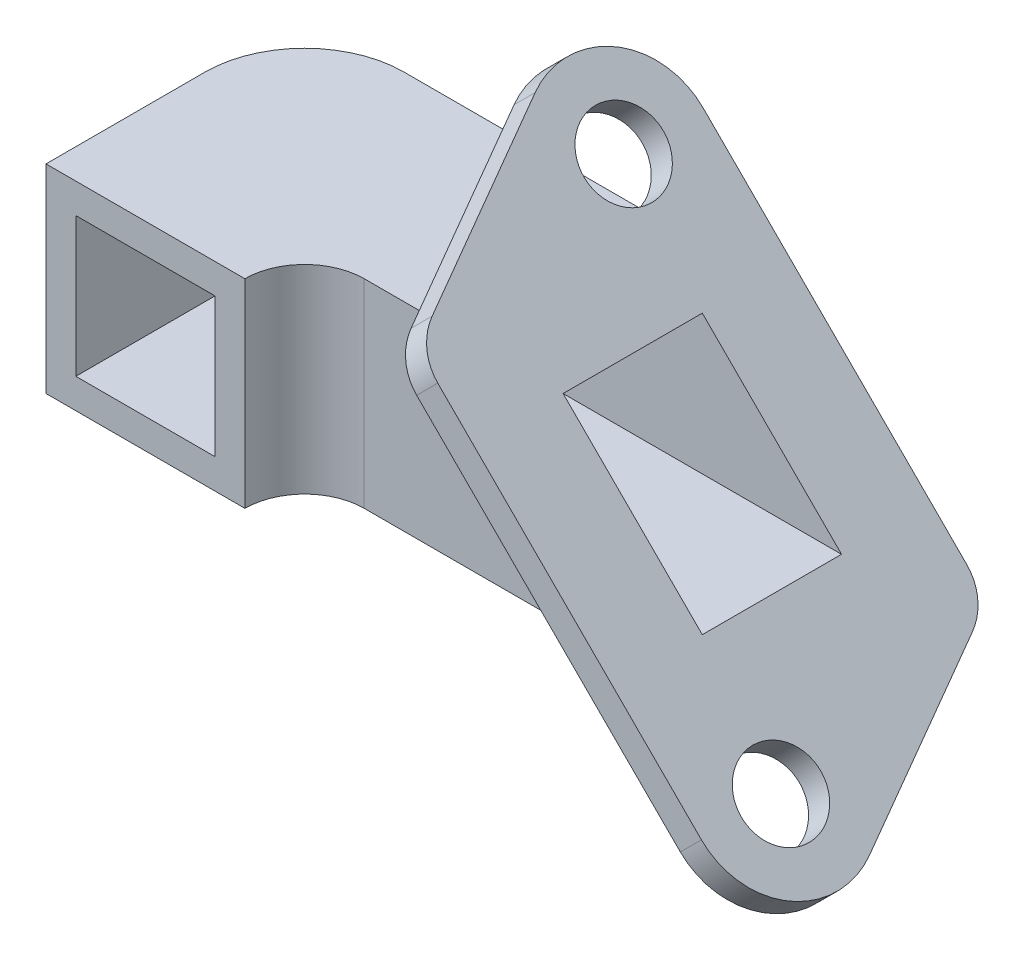
ISO-10303-21;
HEADER;
FILE_DESCRIPTION(('STEP AP214'),'2;1');
FILE_NAME('part.step','',(''),(''),'','','');
FILE_SCHEMA(('AUTOMOTIVE_DESIGN { 1 0 10303 214 1 1 1 1 }'));
ENDSEC;
DATA;
#1=APPLICATION_CONTEXT('core data for automotive mechanical design processes');
#2=APPLICATION_PROTOCOL_DEFINITION('international standard','automotive_design',2000,#1);
#3=PRODUCT_CONTEXT('',#1,'mechanical');
#4=PRODUCT('Part','Part','',(#3));
#5=PRODUCT_RELATED_PRODUCT_CATEGORY('part','',(#4));
#6=PRODUCT_DEFINITION_FORMATION('','',#4);
#7=PRODUCT_DEFINITION_CONTEXT('part definition',#1,'design');
#8=PRODUCT_DEFINITION('design','',#6,#7);
#9=PRODUCT_DEFINITION_SHAPE('','',#8);
#10=(LENGTH_UNIT() NAMED_UNIT(*) SI_UNIT(.MILLI.,.METRE.));
#11=(NAMED_UNIT(*) PLANE_ANGLE_UNIT() SI_UNIT($,.RADIAN.));
#12=(NAMED_UNIT(*) SI_UNIT($,.STERADIAN.) SOLID_ANGLE_UNIT());
#13=UNCERTAINTY_MEASURE_WITH_UNIT(LENGTH_MEASURE(1.E-05),#10,'distance_accuracy_value','');
#14=(GEOMETRIC_REPRESENTATION_CONTEXT(3) GLOBAL_UNCERTAINTY_ASSIGNED_CONTEXT((#13)) GLOBAL_UNIT_ASSIGNED_CONTEXT((#10,
#11,#12)) REPRESENTATION_CONTEXT('',''));
#15=CARTESIAN_POINT('',(0.,0.,0.));
#16=DIRECTION('',(0.,0.,1.));
#17=DIRECTION('',(1.,0.,0.));
#18=AXIS2_PLACEMENT_3D('',#15,#16,#17);
#19=CARTESIAN_POINT('',(56.4558356335607,20.,20.));
#20=DIRECTION('',(0.,0.,-1.));
#21=DIRECTION('',(-1.,0.,0.));
#22=AXIS2_PLACEMENT_3D('',#19,#20,#21);
#23=PLANE('',#22);
#24=DIRECTION('',(0.707106781186546,-0.707106781186549,0.));
#25=VECTOR('',#24,1.);
#26=CARTESIAN_POINT('',(13.985277129661,-22.4705585038996,20.));
#27=LINE('',#26,#25);
#28=CARTESIAN_POINT('',(-28.4852813742385,20.,20.));
#29=VERTEX_POINT('',#28);
#30=CARTESIAN_POINT('',(11.5147186257614,-20.,20.));
#31=VERTEX_POINT('',#30);
#32=EDGE_CURVE('E53',#29,#31,#27,.T.);
#33=ORIENTED_EDGE('',*,*,#32,.F.);
#34=DIRECTION('',(1.,0.,0.));
#35=VECTOR('',#34,1.);
#36=CARTESIAN_POINT('',(56.4558356335607,20.,20.));
#37=LINE('',#36,#35);
#38=CARTESIAN_POINT('',(-48.,20.,20.));
#39=VERTEX_POINT('',#38);
#40=EDGE_CURVE('E322',#39,#29,#37,.T.);
#41=ORIENTED_EDGE('',*,*,#40,.F.);
#42=DIRECTION('',(0.,-1.,0.));
#43=VECTOR('',#42,1.);
#44=CARTESIAN_POINT('',(-48.,20.,20.));
#45=LINE('',#44,#43);
#46=CARTESIAN_POINT('',(-48.,-20.,20.));
#47=VERTEX_POINT('',#46);
#48=EDGE_CURVE('E38',#39,#47,#45,.T.);
#49=ORIENTED_EDGE('',*,*,#48,.T.);
#50=DIRECTION('',(1.,0.,0.));
#51=VECTOR('',#50,1.);
#52=CARTESIAN_POINT('',(56.4558356335607,-20.,20.));
#53=LINE('',#52,#51);
#54=EDGE_CURVE('E336',#47,#31,#53,.T.);
#55=ORIENTED_EDGE('',*,*,#54,.T.);
#56=EDGE_LOOP('',(#33,#41,#49,#55));
#57=FACE_BOUND('',#56,.T.);
#58=ADVANCED_FACE('F30',(#57),#23,.F.);
#59=CARTESIAN_POINT('',(-80.,20.,-20.));
#60=DIRECTION('',(0.,0.,1.));
#61=DIRECTION('',(1.,0.,0.));
#62=AXIS2_PLACEMENT_3D('',#59,#60,#61);
#63=PLANE('',#62);
#64=DIRECTION('',(-0.707106781186546,0.707106781186549,0.));
#65=VECTOR('',#64,1.);
#66=CARTESIAN_POINT('',(-54.2426406871191,45.7573593128808,-20.));
#67=LINE('',#66,#65);
#68=CARTESIAN_POINT('',(11.5147186257614,-20.,-20.));
#69=VERTEX_POINT('',#68);
#70=CARTESIAN_POINT('',(-28.4852813742385,20.,-20.));
#71=VERTEX_POINT('',#70);
#72=EDGE_CURVE('E262',#69,#71,#67,.T.);
#73=ORIENTED_EDGE('',*,*,#72,.F.);
#74=DIRECTION('',(-1.,0.,0.));
#75=VECTOR('',#74,1.);
#76=CARTESIAN_POINT('',(-80.,-20.,-20.));
#77=LINE('',#76,#75);
#78=CARTESIAN_POINT('',(-80.,-20.,-20.));
#79=VERTEX_POINT('',#78);
#80=EDGE_CURVE('E338',#69,#79,#77,.T.);
#81=ORIENTED_EDGE('',*,*,#80,.T.);
#82=DIRECTION('',(0.,-1.,0.));
#83=VECTOR('',#82,1.);
#84=CARTESIAN_POINT('',(-80.,20.,-20.));
#85=LINE('',#84,#83);
#86=CARTESIAN_POINT('',(-80.,20.,-20.));
#87=VERTEX_POINT('',#86);
#88=EDGE_CURVE('E353',#87,#79,#85,.T.);
#89=ORIENTED_EDGE('',*,*,#88,.F.);
#90=DIRECTION('',(-1.,0.,0.));
#91=VECTOR('',#90,1.);
#92=CARTESIAN_POINT('',(-80.,20.,-20.));
#93=LINE('',#92,#91);
#94=EDGE_CURVE('E325',#71,#87,#93,.T.);
#95=ORIENTED_EDGE('',*,*,#94,.F.);
#96=EDGE_LOOP('',(#73,#81,#89,#95));
#97=FACE_BOUND('',#96,.T.);
#98=ADVANCED_FACE('F370',(#97),#63,.F.);
#99=CARTESIAN_POINT('',(-48.,20.,32.));
#100=DIRECTION('',(0.,1.,0.));
#101=DIRECTION('',(0.,0.,1.));
#102=AXIS2_PLACEMENT_3D('',#99,#100,#101);
#103=PLANE('',#102);
#104=ORIENTED_EDGE('',*,*,#40,.T.);
#105=DIRECTION('',(0.,0.,-1.));
#106=VECTOR('',#105,1.);
#107=CARTESIAN_POINT('',(-28.4852813742385,20.,32.));
#108=LINE('',#107,#106);
#109=EDGE_CURVE('E45',#29,#71,#108,.T.);
#110=ORIENTED_EDGE('',*,*,#109,.T.);
#111=ORIENTED_EDGE('',*,*,#94,.T.);
#112=CARTESIAN_POINT('',(-80.,20.,0.));
#113=DIRECTION('',(0.,1.,0.));
#114=DIRECTION('',(0.,0.,-1.));
#115=AXIS2_PLACEMENT_3D('',#112,#113,#114);
#116=CIRCLE('',#115,20.);
#117=CARTESIAN_POINT('',(-100.,20.,0.));
#118=VERTEX_POINT('',#117);
#119=EDGE_CURVE('E327',#87,#118,#116,.T.);
#120=ORIENTED_EDGE('',*,*,#119,.T.);
#121=DIRECTION('',(0.,0.,1.));
#122=VECTOR('',#121,1.);
#123=CARTESIAN_POINT('',(-100.,20.,32.));
#124=LINE('',#123,#122);
#125=CARTESIAN_POINT('',(-100.,20.,32.));
#126=VERTEX_POINT('',#125);
#127=EDGE_CURVE('E329',#118,#126,#124,.T.);
#128=ORIENTED_EDGE('',*,*,#127,.T.);
#129=DIRECTION('',(1.,0.,0.));
#130=VECTOR('',#129,1.);
#131=CARTESIAN_POINT('',(-60.,20.,32.));
#132=LINE('',#131,#130);
#133=CARTESIAN_POINT('',(-60.,20.,32.));
#134=VERTEX_POINT('',#133);
#135=EDGE_CURVE('E331',#126,#134,#132,.T.);
#136=ORIENTED_EDGE('',*,*,#135,.T.);
#137=CARTESIAN_POINT('',(-48.,20.,32.));
#138=DIRECTION('',(0.,-1.,0.));
#139=DIRECTION('',(0.,0.,1.));
#140=AXIS2_PLACEMENT_3D('',#137,#138,#139);
#141=CIRCLE('',#140,12.);
#142=EDGE_CURVE('E319',#134,#39,#141,.T.);
#143=ORIENTED_EDGE('',*,*,#142,.T.);
#144=EDGE_LOOP('',(#104,#110,#111,#120,#128,#136,#143));
#145=FACE_BOUND('',#144,.T.);
#146=ADVANCED_FACE('F373',(#145),#103,.T.);
#147=CARTESIAN_POINT('',(-48.,-20.,32.));
#148=DIRECTION('',(0.,1.,0.));
#149=DIRECTION('',(0.,0.,1.));
#150=AXIS2_PLACEMENT_3D('',#147,#148,#149);
#151=PLANE('',#150);
#152=DIRECTION('',(0.,0.,-1.));
#153=VECTOR('',#152,1.);
#154=CARTESIAN_POINT('',(11.5147186257614,-20.,32.));
#155=LINE('',#154,#153);
#156=EDGE_CURVE('E248',#31,#69,#155,.T.);
#157=ORIENTED_EDGE('',*,*,#156,.F.);
#158=ORIENTED_EDGE('',*,*,#54,.F.);
#159=CARTESIAN_POINT('',(-48.,-20.,32.));
#160=DIRECTION('',(0.,-1.,0.));
#161=DIRECTION('',(0.,0.,1.));
#162=AXIS2_PLACEMENT_3D('',#159,#160,#161);
#163=CIRCLE('',#162,12.);
#164=CARTESIAN_POINT('',(-60.,-20.,32.));
#165=VERTEX_POINT('',#164);
#166=EDGE_CURVE('E282',#165,#47,#163,.T.);
#167=ORIENTED_EDGE('',*,*,#166,.F.);
#168=DIRECTION('',(1.,0.,0.));
#169=VECTOR('',#168,1.);
#170=CARTESIAN_POINT('',(-60.,-20.,32.));
#171=LINE('',#170,#169);
#172=CARTESIAN_POINT('',(-100.,-20.,32.));
#173=VERTEX_POINT('',#172);
#174=EDGE_CURVE('E323',#173,#165,#171,.T.);
#175=ORIENTED_EDGE('',*,*,#174,.F.);
#176=DIRECTION('',(0.,0.,1.));
#177=VECTOR('',#176,1.);
#178=CARTESIAN_POINT('',(-100.,-20.,32.));
#179=LINE('',#178,#177);
#180=CARTESIAN_POINT('',(-100.,-20.,0.));
#181=VERTEX_POINT('',#180);
#182=EDGE_CURVE('E342',#181,#173,#179,.T.);
#183=ORIENTED_EDGE('',*,*,#182,.F.);
#184=CARTESIAN_POINT('',(-80.,-20.,0.));
#185=DIRECTION('',(0.,1.,0.));
#186=DIRECTION('',(0.,0.,-1.));
#187=AXIS2_PLACEMENT_3D('',#184,#185,#186);
#188=CIRCLE('',#187,20.);
#189=EDGE_CURVE('E340',#79,#181,#188,.T.);
#190=ORIENTED_EDGE('',*,*,#189,.F.);
#191=ORIENTED_EDGE('',*,*,#80,.F.);
#192=EDGE_LOOP('',(#157,#158,#167,#175,#183,#190,#191));
#193=FACE_BOUND('',#192,.T.);
#194=ADVANCED_FACE('F363',(#193),#151,.F.);
#195=CARTESIAN_POINT('',(56.4558356335607,20.,14.));
#196=DIRECTION('',(0.,0.,-1.));
#197=DIRECTION('',(-1.,0.,0.));
#198=AXIS2_PLACEMENT_3D('',#195,#196,#197);
#199=PLANE('',#198);
#200=DIRECTION('',(0.707106781186546,-0.707106781186549,0.));
#201=VECTOR('',#200,1.);
#202=CARTESIAN_POINT('',(18.2279178167803,-18.2279178167803,14.));
#203=LINE('',#202,#201);
#204=CARTESIAN_POINT('',(-13.9999999999999,14.,14.));
#205=VERTEX_POINT('',#204);
#206=CARTESIAN_POINT('',(14.,-14.,14.));
#207=VERTEX_POINT('',#206);
#208=EDGE_CURVE('E270',#205,#207,#203,.T.);
#209=ORIENTED_EDGE('',*,*,#208,.T.);
#210=DIRECTION('',(1.,0.,0.));
#211=VECTOR('',#210,1.);
#212=CARTESIAN_POINT('',(56.4558356335607,-14.,14.));
#213=LINE('',#212,#211);
#214=CARTESIAN_POINT('',(-48.,-14.,14.));
#215=VERTEX_POINT('',#214);
#216=EDGE_CURVE('E278',#215,#207,#213,.T.);
#217=ORIENTED_EDGE('',*,*,#216,.F.);
#218=DIRECTION('',(0.,1.,0.));
#219=VECTOR('',#218,1.);
#220=CARTESIAN_POINT('',(-48.,20.,14.));
#221=LINE('',#220,#219);
#222=CARTESIAN_POINT('',(-48.,14.,14.));
#223=VERTEX_POINT('',#222);
#224=EDGE_CURVE('E279',#223,#215,#221,.F.);
#225=ORIENTED_EDGE('',*,*,#224,.F.);
#226=DIRECTION('',(1.,0.,0.));
#227=VECTOR('',#226,1.);
#228=CARTESIAN_POINT('',(56.4558356335607,14.,14.));
#229=LINE('',#228,#227);
#230=EDGE_CURVE('E287',#223,#205,#229,.T.);
#231=ORIENTED_EDGE('',*,*,#230,.T.);
#232=EDGE_LOOP('',(#209,#217,#225,#231));
#233=FACE_BOUND('',#232,.T.);
#234=ADVANCED_FACE('F398',(#233),#199,.T.);
#235=CARTESIAN_POINT('',(-80.,20.,-14.));
#236=DIRECTION('',(0.,0.,1.));
#237=DIRECTION('',(1.,0.,0.));
#238=AXIS2_PLACEMENT_3D('',#235,#236,#237);
#239=PLANE('',#238);
#240=DIRECTION('',(-1.,0.,0.));
#241=VECTOR('',#240,1.);
#242=CARTESIAN_POINT('',(-80.,14.,-14.));
#243=LINE('',#242,#241);
#244=CARTESIAN_POINT('',(-13.9999999999999,14.,-14.));
#245=VERTEX_POINT('',#244);
#246=CARTESIAN_POINT('',(-80.,14.,-14.));
#247=VERTEX_POINT('',#246);
#248=EDGE_CURVE('E292',#245,#247,#243,.T.);
#249=ORIENTED_EDGE('',*,*,#248,.T.);
#250=DIRECTION('',(0.,-1.,0.));
#251=VECTOR('',#250,1.);
#252=CARTESIAN_POINT('',(-80.,20.,-14.));
#253=LINE('',#252,#251);
#254=CARTESIAN_POINT('',(-80.,-14.,-14.));
#255=VERTEX_POINT('',#254);
#256=EDGE_CURVE('E283',#247,#255,#253,.T.);
#257=ORIENTED_EDGE('',*,*,#256,.T.);
#258=DIRECTION('',(-1.,0.,0.));
#259=VECTOR('',#258,1.);
#260=CARTESIAN_POINT('',(-80.,-14.,-14.));
#261=LINE('',#260,#259);
#262=CARTESIAN_POINT('',(13.9999999999999,-14.,-14.));
#263=VERTEX_POINT('',#262);
#264=EDGE_CURVE('E290',#263,#255,#261,.T.);
#265=ORIENTED_EDGE('',*,*,#264,.F.);
#266=DIRECTION('',(-0.707106781186546,0.707106781186549,0.));
#267=VECTOR('',#266,1.);
#268=CARTESIAN_POINT('',(-49.9999999999999,50.,-14.));
#269=LINE('',#268,#267);
#270=EDGE_CURVE('E267',#263,#245,#269,.T.);
#271=ORIENTED_EDGE('',*,*,#270,.T.);
#272=EDGE_LOOP('',(#249,#257,#265,#271));
#273=FACE_BOUND('',#272,.T.);
#274=ADVANCED_FACE('F408',(#273),#239,.T.);
#275=CARTESIAN_POINT('',(-48.,14.,32.));
#276=DIRECTION('',(0.,1.,0.));
#277=DIRECTION('',(0.,0.,1.));
#278=AXIS2_PLACEMENT_3D('',#275,#276,#277);
#279=PLANE('',#278);
#280=DIRECTION('',(0.,0.,-1.));
#281=VECTOR('',#280,1.);
#282=CARTESIAN_POINT('',(-14.,14.,32.));
#283=LINE('',#282,#281);
#284=EDGE_CURVE('E273',#205,#245,#283,.T.);
#285=ORIENTED_EDGE('',*,*,#284,.F.);
#286=ORIENTED_EDGE('',*,*,#230,.F.);
#287=CARTESIAN_POINT('',(-48.,14.,32.));
#288=DIRECTION('',(0.,1.,0.));
#289=DIRECTION('',(0.,0.,1.));
#290=AXIS2_PLACEMENT_3D('',#287,#288,#289);
#291=CIRCLE('',#290,18.);
#292=CARTESIAN_POINT('',(-66.,14.,32.));
#293=VERTEX_POINT('',#292);
#294=EDGE_CURVE('E284',#293,#223,#291,.F.);
#295=ORIENTED_EDGE('',*,*,#294,.F.);
#296=DIRECTION('',(1.,0.,0.));
#297=VECTOR('',#296,1.);
#298=CARTESIAN_POINT('',(-60.,14.,32.));
#299=LINE('',#298,#297);
#300=CARTESIAN_POINT('',(-94.,14.,32.));
#301=VERTEX_POINT('',#300);
#302=EDGE_CURVE('E299',#301,#293,#299,.T.);
#303=ORIENTED_EDGE('',*,*,#302,.F.);
#304=DIRECTION('',(0.,0.,1.));
#305=VECTOR('',#304,1.);
#306=CARTESIAN_POINT('',(-94.,14.,32.));
#307=LINE('',#306,#305);
#308=CARTESIAN_POINT('',(-94.,14.,0.));
#309=VERTEX_POINT('',#308);
#310=EDGE_CURVE('E296',#309,#301,#307,.T.);
#311=ORIENTED_EDGE('',*,*,#310,.F.);
#312=CARTESIAN_POINT('',(-80.,14.,0.));
#313=DIRECTION('',(0.,1.,0.));
#314=DIRECTION('',(0.,0.,1.));
#315=AXIS2_PLACEMENT_3D('',#312,#313,#314);
#316=CIRCLE('',#315,14.);
#317=EDGE_CURVE('E294',#247,#309,#316,.T.);
#318=ORIENTED_EDGE('',*,*,#317,.F.);
#319=ORIENTED_EDGE('',*,*,#248,.F.);
#320=EDGE_LOOP('',(#285,#286,#295,#303,#311,#318,#319));
#321=FACE_BOUND('',#320,.T.);
#322=ADVANCED_FACE('F412',(#321),#279,.F.);
#323=CARTESIAN_POINT('',(-48.,-14.,32.));
#324=DIRECTION('',(0.,1.,0.));
#325=DIRECTION('',(0.,0.,1.));
#326=AXIS2_PLACEMENT_3D('',#323,#324,#325);
#327=PLANE('',#326);
#328=ORIENTED_EDGE('',*,*,#216,.T.);
#329=DIRECTION('',(0.,0.,-1.));
#330=VECTOR('',#329,1.);
#331=CARTESIAN_POINT('',(14.,-14.,32.));
#332=LINE('',#331,#330);
#333=EDGE_CURVE('E11',#207,#263,#332,.T.);
#334=ORIENTED_EDGE('',*,*,#333,.T.);
#335=ORIENTED_EDGE('',*,*,#264,.T.);
#336=CARTESIAN_POINT('',(-80.,-14.,0.));
#337=DIRECTION('',(0.,1.,0.));
#338=DIRECTION('',(0.,0.,1.));
#339=AXIS2_PLACEMENT_3D('',#336,#337,#338);
#340=CIRCLE('',#339,14.);
#341=CARTESIAN_POINT('',(-94.,-14.,0.));
#342=VERTEX_POINT('',#341);
#343=EDGE_CURVE('E301',#255,#342,#340,.T.);
#344=ORIENTED_EDGE('',*,*,#343,.T.);
#345=DIRECTION('',(0.,0.,1.));
#346=VECTOR('',#345,1.);
#347=CARTESIAN_POINT('',(-94.,-14.,32.));
#348=LINE('',#347,#346);
#349=CARTESIAN_POINT('',(-94.,-14.,32.));
#350=VERTEX_POINT('',#349);
#351=EDGE_CURVE('E306',#342,#350,#348,.T.);
#352=ORIENTED_EDGE('',*,*,#351,.T.);
#353=DIRECTION('',(1.,0.,0.));
#354=VECTOR('',#353,1.);
#355=CARTESIAN_POINT('',(-60.,-14.,32.));
#356=LINE('',#355,#354);
#357=CARTESIAN_POINT('',(-66.,-14.,32.));
#358=VERTEX_POINT('',#357);
#359=EDGE_CURVE('E288',#350,#358,#356,.T.);
#360=ORIENTED_EDGE('',*,*,#359,.T.);
#361=CARTESIAN_POINT('',(-48.,-14.,32.));
#362=DIRECTION('',(0.,1.,0.));
#363=DIRECTION('',(0.,0.,1.));
#364=AXIS2_PLACEMENT_3D('',#361,#362,#363);
#365=CIRCLE('',#364,18.);
#366=EDGE_CURVE('E275',#358,#215,#365,.F.);
#367=ORIENTED_EDGE('',*,*,#366,.T.);
#368=EDGE_LOOP('',(#328,#334,#335,#344,#352,#360,#367));
#369=FACE_BOUND('',#368,.T.);
#370=ADVANCED_FACE('F386',(#369),#327,.T.);
#371=CARTESIAN_POINT('',(-60.,20.,32.));
#372=DIRECTION('',(0.,0.,-1.));
#373=DIRECTION('',(-1.,0.,0.));
#374=AXIS2_PLACEMENT_3D('',#371,#372,#373);
#375=PLANE('',#374);
#376=ORIENTED_EDGE('',*,*,#174,.T.);
#377=DIRECTION('',(0.,-1.,0.));
#378=VECTOR('',#377,1.);
#379=CARTESIAN_POINT('',(-60.,20.,32.));
#380=LINE('',#379,#378);
#381=EDGE_CURVE('E333',#134,#165,#380,.T.);
#382=ORIENTED_EDGE('',*,*,#381,.F.);
#383=ORIENTED_EDGE('',*,*,#135,.F.);
#384=DIRECTION('',(0.,-1.,0.));
#385=VECTOR('',#384,1.);
#386=CARTESIAN_POINT('',(-100.,20.,32.));
#387=LINE('',#386,#385);
#388=EDGE_CURVE('E347',#126,#173,#387,.T.);
#389=ORIENTED_EDGE('',*,*,#388,.T.);
#390=EDGE_LOOP('',(#376,#382,#383,#389));
#391=FACE_BOUND('',#390,.T.);
#392=ORIENTED_EDGE('',*,*,#359,.F.);
#393=DIRECTION('',(0.,-1.,0.));
#394=VECTOR('',#393,1.);
#395=CARTESIAN_POINT('',(-94.,20.,32.));
#396=LINE('',#395,#394);
#397=EDGE_CURVE('E309',#301,#350,#396,.T.);
#398=ORIENTED_EDGE('',*,*,#397,.F.);
#399=ORIENTED_EDGE('',*,*,#302,.T.);
#400=DIRECTION('',(0.,-1.,0.));
#401=VECTOR('',#400,1.);
#402=CARTESIAN_POINT('',(-66.,14.,32.));
#403=LINE('',#402,#401);
#404=EDGE_CURVE('E311',#293,#358,#403,.T.);
#405=ORIENTED_EDGE('',*,*,#404,.T.);
#406=EDGE_LOOP('',(#392,#398,#399,#405));
#407=FACE_BOUND('',#406,.T.);
#408=ADVANCED_FACE('F383',(#391,#407),#375,.F.);
#409=CARTESIAN_POINT('',(-48.,20.,32.));
#410=DIRECTION('',(0.,-1.,0.));
#411=DIRECTION('',(0.,0.,-1.));
#412=AXIS2_PLACEMENT_3D('',#409,#410,#411);
#413=CYLINDRICAL_SURFACE('',#412,12.);
#414=ORIENTED_EDGE('',*,*,#166,.T.);
#415=ORIENTED_EDGE('',*,*,#48,.F.);
#416=ORIENTED_EDGE('',*,*,#142,.F.);
#417=ORIENTED_EDGE('',*,*,#381,.T.);
#418=EDGE_LOOP('',(#414,#415,#416,#417));
#419=FACE_BOUND('',#418,.T.);
#420=ADVANCED_FACE('F32',(#419),#413,.F.);
#421=CARTESIAN_POINT('',(-80.,20.,0.));
#422=DIRECTION('',(0.,-1.,0.));
#423=DIRECTION('',(0.,0.,-1.));
#424=AXIS2_PLACEMENT_3D('',#421,#422,#423);
#425=CYLINDRICAL_SURFACE('',#424,20.);
#426=ORIENTED_EDGE('',*,*,#189,.T.);
#427=DIRECTION('',(0.,-1.,0.));
#428=VECTOR('',#427,1.);
#429=CARTESIAN_POINT('',(-100.,20.,0.));
#430=LINE('',#429,#428);
#431=EDGE_CURVE('E350',#118,#181,#430,.T.);
#432=ORIENTED_EDGE('',*,*,#431,.F.);
#433=ORIENTED_EDGE('',*,*,#119,.F.);
#434=ORIENTED_EDGE('',*,*,#88,.T.);
#435=EDGE_LOOP('',(#426,#432,#433,#434));
#436=FACE_BOUND('',#435,.T.);
#437=ADVANCED_FACE('F378',(#436),#425,.T.);
#438=CARTESIAN_POINT('',(-100.,20.,32.));
#439=DIRECTION('',(1.,0.,0.));
#440=DIRECTION('',(0.,0.,-1.));
#441=AXIS2_PLACEMENT_3D('',#438,#439,#440);
#442=PLANE('',#441);
#443=ORIENTED_EDGE('',*,*,#182,.T.);
#444=ORIENTED_EDGE('',*,*,#388,.F.);
#445=ORIENTED_EDGE('',*,*,#127,.F.);
#446=ORIENTED_EDGE('',*,*,#431,.T.);
#447=EDGE_LOOP('',(#443,#444,#445,#446));
#448=FACE_BOUND('',#447,.T.);
#449=ADVANCED_FACE('F380',(#448),#442,.F.);
#450=CARTESIAN_POINT('',(-48.,20.,32.));
#451=DIRECTION('',(0.,-1.,0.));
#452=DIRECTION('',(0.,0.,-1.));
#453=AXIS2_PLACEMENT_3D('',#450,#451,#452);
#454=CYLINDRICAL_SURFACE('',#453,18.);
#455=ORIENTED_EDGE('',*,*,#366,.F.);
#456=ORIENTED_EDGE('',*,*,#404,.F.);
#457=ORIENTED_EDGE('',*,*,#294,.T.);
#458=ORIENTED_EDGE('',*,*,#224,.T.);
#459=EDGE_LOOP('',(#455,#456,#457,#458));
#460=FACE_BOUND('',#459,.T.);
#461=ADVANCED_FACE('F394',(#460),#454,.T.);
#462=CARTESIAN_POINT('',(-80.,20.,0.));
#463=DIRECTION('',(0.,-1.,0.));
#464=DIRECTION('',(0.,0.,-1.));
#465=AXIS2_PLACEMENT_3D('',#462,#463,#464);
#466=CYLINDRICAL_SURFACE('',#465,14.);
#467=ORIENTED_EDGE('',*,*,#343,.F.);
#468=ORIENTED_EDGE('',*,*,#256,.F.);
#469=ORIENTED_EDGE('',*,*,#317,.T.);
#470=DIRECTION('',(0.,1.,0.));
#471=VECTOR('',#470,1.);
#472=CARTESIAN_POINT('',(-94.,20.,0.));
#473=LINE('',#472,#471);
#474=EDGE_CURVE('E304',#309,#342,#473,.F.);
#475=ORIENTED_EDGE('',*,*,#474,.T.);
#476=EDGE_LOOP('',(#467,#468,#469,#475));
#477=FACE_BOUND('',#476,.T.);
#478=ADVANCED_FACE('F417',(#477),#466,.F.);
#479=CARTESIAN_POINT('',(-94.,20.,32.));
#480=DIRECTION('',(1.,0.,0.));
#481=DIRECTION('',(0.,0.,-1.));
#482=AXIS2_PLACEMENT_3D('',#479,#480,#481);
#483=PLANE('',#482);
#484=ORIENTED_EDGE('',*,*,#351,.F.);
#485=ORIENTED_EDGE('',*,*,#474,.F.);
#486=ORIENTED_EDGE('',*,*,#310,.T.);
#487=ORIENTED_EDGE('',*,*,#397,.T.);
#488=EDGE_LOOP('',(#484,#485,#486,#487));
#489=FACE_BOUND('',#488,.T.);
#490=ADVANCED_FACE('F419',(#489),#483,.T.);
#491=CARTESIAN_POINT('',(-31.7481256185349,31.748125618535,282.067311335766));
#492=DIRECTION('',(0.707106781186549,0.707106781186546,0.));
#493=DIRECTION('',(-0.707106781186546,0.707106781186549,0.));
#494=AXIS2_PLACEMENT_3D('',#491,#492,#493);
#495=PLANE('',#494);
#496=ORIENTED_EDGE('',*,*,#208,.F.);
#497=ORIENTED_EDGE('',*,*,#284,.T.);
#498=ORIENTED_EDGE('',*,*,#270,.F.);
#499=ORIENTED_EDGE('',*,*,#333,.F.);
#500=EDGE_LOOP('',(#496,#497,#498,#499));
#501=FACE_BOUND('',#500,.T.);
#502=CARTESIAN_POINT('',(31.8198051533946,-31.8198051533947,16.));
#503=DIRECTION('',(0.707106781186549,0.707106781186546,0.));
#504=DIRECTION('',(-0.707106781186546,0.707106781186549,0.));
#505=AXIS2_PLACEMENT_3D('',#502,#503,#504);
#506=CIRCLE('',#505,8.);
#507=CARTESIAN_POINT('',(26.1629509039022,-26.1629509039023,16.));
#508=VERTEX_POINT('',#507);
#509=EDGE_CURVE('E501',#508,#508,#506,.T.);
#510=ORIENTED_EDGE('',*,*,#509,.F.);
#511=EDGE_LOOP('',(#510));
#512=FACE_BOUND('',#511,.T.);
#513=CARTESIAN_POINT('',(-31.8198051533946,31.8198051533947,-16.));
#514=DIRECTION('',(0.707106781186549,0.707106781186546,0.));
#515=DIRECTION('',(-0.707106781186546,0.707106781186549,0.));
#516=AXIS2_PLACEMENT_3D('',#513,#514,#515);
#517=CIRCLE('',#516,8.);
#518=CARTESIAN_POINT('',(-37.476659402887,37.4766594028871,-16.));
#519=VERTEX_POINT('',#518);
#520=EDGE_CURVE('E212',#519,#519,#517,.T.);
#521=ORIENTED_EDGE('',*,*,#520,.F.);
#522=EDGE_LOOP('',(#521));
#523=FACE_BOUND('',#522,.T.);
#524=CARTESIAN_POINT('',(31.8198051533946,-31.8198051533947,16.));
#525=DIRECTION('',(0.707106781186549,0.707106781186546,0.));
#526=DIRECTION('',(-0.707106781186546,0.707106781186549,0.));
#527=AXIS2_PLACEMENT_3D('',#524,#525,#526);
#528=CIRCLE('',#527,16.);
#529=CARTESIAN_POINT('',(31.8198051533946,-31.8198051533947,32.));
#530=VERTEX_POINT('',#529);
#531=CARTESIAN_POINT('',(41.6177641245272,-41.6177641245274,7.99999999999992));
#532=VERTEX_POINT('',#531);
#533=EDGE_CURVE('E229',#530,#532,#528,.T.);
#534=ORIENTED_EDGE('',*,*,#533,.T.);
#535=DIRECTION('',(-0.353553390593276,0.353553390593278,-0.866025403784436));
#536=VECTOR('',#535,1.);
#537=CARTESIAN_POINT('',(41.6177641245272,-41.6177641245274,7.99999999999992));
#538=LINE('',#537,#536);
#539=CARTESIAN_POINT('',(27.3290739582919,-27.329073958292,-27.0000000000001));
#540=VERTEX_POINT('',#539);
#541=EDGE_CURVE('E185',#532,#540,#538,.T.);
#542=ORIENTED_EDGE('',*,*,#541,.T.);
#543=CARTESIAN_POINT('',(21.205349601334,-21.2053496013341,-22.));
#544=DIRECTION('',(0.707106781186549,0.707106781186546,0.));
#545=DIRECTION('',(-0.707106781186546,0.707106781186549,0.));
#546=AXIS2_PLACEMENT_3D('',#543,#544,#545);
#547=CIRCLE('',#546,10.);
#548=CARTESIAN_POINT('',(21.205349601334,-21.2053496013341,-32.));
#549=VERTEX_POINT('',#548);
#550=EDGE_CURVE('E233',#540,#549,#547,.T.);
#551=ORIENTED_EDGE('',*,*,#550,.T.);
#552=DIRECTION('',(-0.707106781186546,0.707106781186549,0.));
#553=VECTOR('',#552,1.);
#554=CARTESIAN_POINT('',(21.205349601334,-21.2053496013341,-32.));
#555=LINE('',#554,#553);
#556=CARTESIAN_POINT('',(-31.8198051533946,31.8198051533947,-32.));
#557=VERTEX_POINT('',#556);
#558=EDGE_CURVE('E236',#549,#557,#555,.T.);
#559=ORIENTED_EDGE('',*,*,#558,.T.);
#560=CARTESIAN_POINT('',(-31.8198051533946,31.8198051533947,-16.));
#561=DIRECTION('',(0.707106781186549,0.707106781186546,0.));
#562=DIRECTION('',(-0.707106781186546,0.707106781186549,0.));
#563=AXIS2_PLACEMENT_3D('',#560,#561,#562);
#564=CIRCLE('',#563,16.);
#565=CARTESIAN_POINT('',(-41.6177641245272,41.6177641245274,-7.99999999999993));
#566=VERTEX_POINT('',#565);
#567=EDGE_CURVE('E239',#557,#566,#564,.T.);
#568=ORIENTED_EDGE('',*,*,#567,.T.);
#569=DIRECTION('',(0.353553390593276,-0.353553390593277,0.866025403784436));
#570=VECTOR('',#569,1.);
#571=CARTESIAN_POINT('',(-41.6177641245272,41.6177641245274,-7.99999999999993));
#572=LINE('',#571,#570);
#573=CARTESIAN_POINT('',(-27.3290739582919,27.329073958292,27.));
#574=VERTEX_POINT('',#573);
#575=EDGE_CURVE('E242',#566,#574,#572,.T.);
#576=ORIENTED_EDGE('',*,*,#575,.T.);
#577=CARTESIAN_POINT('',(-21.205349601334,21.2053496013341,22.));
#578=DIRECTION('',(0.707106781186549,0.707106781186546,0.));
#579=DIRECTION('',(-0.707106781186546,0.707106781186549,0.));
#580=AXIS2_PLACEMENT_3D('',#577,#578,#579);
#581=CIRCLE('',#580,10.);
#582=CARTESIAN_POINT('',(-21.205349601334,21.2053496013341,32.));
#583=VERTEX_POINT('',#582);
#584=EDGE_CURVE('E209',#574,#583,#581,.T.);
#585=ORIENTED_EDGE('',*,*,#584,.T.);
#586=DIRECTION('',(0.707106781186546,-0.707106781186549,0.));
#587=VECTOR('',#586,1.);
#588=CARTESIAN_POINT('',(-21.205349601334,21.2053496013341,32.));
#589=LINE('',#588,#587);
#590=EDGE_CURVE('E206',#583,#530,#589,.T.);
#591=ORIENTED_EDGE('',*,*,#590,.T.);
#592=EDGE_LOOP('',(#534,#542,#551,#559,#568,#576,#585,#591));
#593=FACE_BOUND('',#592,.T.);
#594=ADVANCED_FACE('F403',(#501,#512,#523,#593),#495,.T.);
#595=CARTESIAN_POINT('',(27.5771644662753,-36.062445840514,16.));
#596=DIRECTION('',(0.707106781186549,0.707106781186546,0.));
#597=DIRECTION('',(-0.707106781186546,0.707106781186549,0.));
#598=AXIS2_PLACEMENT_3D('',#595,#596,#597);
#599=CYLINDRICAL_SURFACE('',#598,16.);
#600=ORIENTED_EDGE('',*,*,#533,.F.);
#601=DIRECTION('',(0.707106781186549,0.707106781186546,0.));
#602=VECTOR('',#601,1.);
#603=CARTESIAN_POINT('',(27.5771644662753,-36.062445840514,32.));
#604=LINE('',#603,#602);
#605=CARTESIAN_POINT('',(27.5771644662753,-36.062445840514,32.));
#606=VERTEX_POINT('',#605);
#607=EDGE_CURVE('E205',#606,#530,#604,.T.);
#608=ORIENTED_EDGE('',*,*,#607,.F.);
#609=CARTESIAN_POINT('',(27.5771644662753,-36.062445840514,16.));
#610=DIRECTION('',(0.707106781186549,0.707106781186546,0.));
#611=DIRECTION('',(-0.707106781186546,0.707106781186549,0.));
#612=AXIS2_PLACEMENT_3D('',#609,#610,#611);
#613=CIRCLE('',#612,16.);
#614=CARTESIAN_POINT('',(37.375123437408,-45.8604048116467,7.99999999999993));
#615=VERTEX_POINT('',#614);
#616=EDGE_CURVE('E198',#606,#615,#613,.T.);
#617=ORIENTED_EDGE('',*,*,#616,.T.);
#618=DIRECTION('',(0.707106781186549,0.707106781186546,0.));
#619=VECTOR('',#618,1.);
#620=CARTESIAN_POINT('',(37.375123437408,-45.8604048116467,7.99999999999993));
#621=LINE('',#620,#619);
#622=EDGE_CURVE('E180',#615,#532,#621,.T.);
#623=ORIENTED_EDGE('',*,*,#622,.T.);
#624=EDGE_LOOP('',(#600,#608,#617,#623));
#625=FACE_BOUND('',#624,.T.);
#626=ADVANCED_FACE('F204',(#625),#599,.T.);
#627=CARTESIAN_POINT('',(-25.4479902884533,16.9627089142148,32.));
#628=DIRECTION('',(0.,0.,1.));
#629=DIRECTION('',(0.,-1.,0.));
#630=AXIS2_PLACEMENT_3D('',#627,#628,#629);
#631=PLANE('',#630);
#632=ORIENTED_EDGE('',*,*,#590,.F.);
#633=DIRECTION('',(0.707106781186549,0.707106781186546,0.));
#634=VECTOR('',#633,1.);
#635=CARTESIAN_POINT('',(-25.4479902884533,16.9627089142148,32.));
#636=LINE('',#635,#634);
#637=CARTESIAN_POINT('',(-25.4479902884533,16.9627089142148,32.));
#638=VERTEX_POINT('',#637);
#639=EDGE_CURVE('E249',#638,#583,#636,.T.);
#640=ORIENTED_EDGE('',*,*,#639,.F.);
#641=DIRECTION('',(0.707106781186546,-0.707106781186549,0.));
#642=VECTOR('',#641,1.);
#643=CARTESIAN_POINT('',(-25.4479902884533,16.9627089142148,32.));
#644=LINE('',#643,#642);
#645=EDGE_CURVE('E191',#638,#606,#644,.T.);
#646=ORIENTED_EDGE('',*,*,#645,.T.);
#647=ORIENTED_EDGE('',*,*,#607,.T.);
#648=EDGE_LOOP('',(#632,#640,#646,#647));
#649=FACE_BOUND('',#648,.T.);
#650=ADVANCED_FACE('F458',(#649),#631,.T.);
#651=CARTESIAN_POINT('',(-25.4479902884533,16.9627089142148,22.));
#652=DIRECTION('',(0.707106781186549,0.707106781186546,0.));
#653=DIRECTION('',(-0.707106781186546,0.707106781186549,0.));
#654=AXIS2_PLACEMENT_3D('',#651,#652,#653);
#655=CYLINDRICAL_SURFACE('',#654,10.);
#656=ORIENTED_EDGE('',*,*,#584,.F.);
#657=DIRECTION('',(0.707106781186549,0.707106781186546,0.));
#658=VECTOR('',#657,1.);
#659=CARTESIAN_POINT('',(-31.5717146454112,23.0864332711727,27.));
#660=LINE('',#659,#658);
#661=CARTESIAN_POINT('',(-31.5717146454112,23.0864332711727,27.));
#662=VERTEX_POINT('',#661);
#663=EDGE_CURVE('E251',#662,#574,#660,.T.);
#664=ORIENTED_EDGE('',*,*,#663,.F.);
#665=CARTESIAN_POINT('',(-25.4479902884533,16.9627089142148,22.));
#666=DIRECTION('',(0.707106781186549,0.707106781186546,0.));
#667=DIRECTION('',(-0.707106781186546,0.707106781186549,0.));
#668=AXIS2_PLACEMENT_3D('',#665,#666,#667);
#669=CIRCLE('',#668,10.);
#670=EDGE_CURVE('E225',#662,#638,#669,.T.);
#671=ORIENTED_EDGE('',*,*,#670,.T.);
#672=ORIENTED_EDGE('',*,*,#639,.T.);
#673=EDGE_LOOP('',(#656,#664,#671,#672));
#674=FACE_BOUND('',#673,.T.);
#675=ADVANCED_FACE('F476',(#674),#655,.T.);
#676=CARTESIAN_POINT('',(-45.8604048116465,37.3751234374081,-7.99999999999993));
#677=DIRECTION('',(-0.612372435695792,0.612372435695794,0.500000000000004));
#678=DIRECTION('',(-0.707106781186549,-0.707106781186546,0.));
#679=AXIS2_PLACEMENT_3D('',#676,#677,#678);
#680=PLANE('',#679);
#681=ORIENTED_EDGE('',*,*,#575,.F.);
#682=DIRECTION('',(0.707106781186549,0.707106781186546,0.));
#683=VECTOR('',#682,1.);
#684=CARTESIAN_POINT('',(-45.8604048116465,37.3751234374081,-7.99999999999993));
#685=LINE('',#684,#683);
#686=CARTESIAN_POINT('',(-45.8604048116465,37.3751234374081,-7.99999999999993));
#687=VERTEX_POINT('',#686);
#688=EDGE_CURVE('E253',#687,#566,#685,.T.);
#689=ORIENTED_EDGE('',*,*,#688,.F.);
#690=DIRECTION('',(0.353553390593276,-0.353553390593277,0.866025403784436));
#691=VECTOR('',#690,1.);
#692=CARTESIAN_POINT('',(-45.8604048116465,37.3751234374081,-7.99999999999993));
#693=LINE('',#692,#691);
#694=EDGE_CURVE('E222',#687,#662,#693,.T.);
#695=ORIENTED_EDGE('',*,*,#694,.T.);
#696=ORIENTED_EDGE('',*,*,#663,.T.);
#697=EDGE_LOOP('',(#681,#689,#695,#696));
#698=FACE_BOUND('',#697,.T.);
#699=ADVANCED_FACE('F472',(#698),#680,.T.);
#700=CARTESIAN_POINT('',(-36.0624458405139,27.5771644662754,-16.));
#701=DIRECTION('',(0.707106781186549,0.707106781186546,0.));
#702=DIRECTION('',(-0.707106781186546,0.707106781186549,0.));
#703=AXIS2_PLACEMENT_3D('',#700,#701,#702);
#704=CYLINDRICAL_SURFACE('',#703,16.);
#705=ORIENTED_EDGE('',*,*,#567,.F.);
#706=DIRECTION('',(0.707106781186549,0.707106781186546,0.));
#707=VECTOR('',#706,1.);
#708=CARTESIAN_POINT('',(-36.0624458405139,27.5771644662754,-32.));
#709=LINE('',#708,#707);
#710=CARTESIAN_POINT('',(-36.0624458405139,27.5771644662754,-32.));
#711=VERTEX_POINT('',#710);
#712=EDGE_CURVE('E255',#711,#557,#709,.T.);
#713=ORIENTED_EDGE('',*,*,#712,.F.);
#714=CARTESIAN_POINT('',(-36.0624458405139,27.5771644662754,-16.));
#715=DIRECTION('',(0.707106781186549,0.707106781186546,0.));
#716=DIRECTION('',(-0.707106781186546,0.707106781186549,0.));
#717=AXIS2_PLACEMENT_3D('',#714,#715,#716);
#718=CIRCLE('',#717,16.);
#719=EDGE_CURVE('E219',#711,#687,#718,.T.);
#720=ORIENTED_EDGE('',*,*,#719,.T.);
#721=ORIENTED_EDGE('',*,*,#688,.T.);
#722=EDGE_LOOP('',(#705,#713,#720,#721));
#723=FACE_BOUND('',#722,.T.);
#724=ADVANCED_FACE('F468',(#723),#704,.T.);
#725=CARTESIAN_POINT('',(16.9627089142147,-25.4479902884533,-32.));
#726=DIRECTION('',(0.,0.,-1.));
#727=DIRECTION('',(-1.,0.,0.));
#728=AXIS2_PLACEMENT_3D('',#725,#726,#727);
#729=PLANE('',#728);
#730=ORIENTED_EDGE('',*,*,#558,.F.);
#731=DIRECTION('',(0.707106781186549,0.707106781186546,0.));
#732=VECTOR('',#731,1.);
#733=CARTESIAN_POINT('',(16.9627089142147,-25.4479902884533,-32.));
#734=LINE('',#733,#732);
#735=CARTESIAN_POINT('',(16.9627089142147,-25.4479902884533,-32.));
#736=VERTEX_POINT('',#735);
#737=EDGE_CURVE('E257',#736,#549,#734,.T.);
#738=ORIENTED_EDGE('',*,*,#737,.F.);
#739=DIRECTION('',(-0.707106781186546,0.707106781186549,0.));
#740=VECTOR('',#739,1.);
#741=CARTESIAN_POINT('',(16.9627089142147,-25.4479902884533,-32.));
#742=LINE('',#741,#740);
#743=EDGE_CURVE('E216',#736,#711,#742,.T.);
#744=ORIENTED_EDGE('',*,*,#743,.T.);
#745=ORIENTED_EDGE('',*,*,#712,.T.);
#746=EDGE_LOOP('',(#730,#738,#744,#745));
#747=FACE_BOUND('',#746,.T.);
#748=ADVANCED_FACE('F464',(#747),#729,.T.);
#749=CARTESIAN_POINT('',(16.9627089142147,-25.4479902884533,-22.));
#750=DIRECTION('',(0.707106781186549,0.707106781186546,0.));
#751=DIRECTION('',(-0.707106781186546,0.707106781186549,0.));
#752=AXIS2_PLACEMENT_3D('',#749,#750,#751);
#753=CYLINDRICAL_SURFACE('',#752,10.);
#754=ORIENTED_EDGE('',*,*,#550,.F.);
#755=DIRECTION('',(0.707106781186549,0.707106781186546,0.));
#756=VECTOR('',#755,1.);
#757=CARTESIAN_POINT('',(23.0864332711726,-31.5717146454113,-27.));
#758=LINE('',#757,#756);
#759=CARTESIAN_POINT('',(23.0864332711726,-31.5717146454113,-27.));
#760=VERTEX_POINT('',#759);
#761=EDGE_CURVE('E190',#760,#540,#758,.T.);
#762=ORIENTED_EDGE('',*,*,#761,.F.);
#763=CARTESIAN_POINT('',(16.9627089142147,-25.4479902884533,-22.));
#764=DIRECTION('',(0.707106781186549,0.707106781186546,0.));
#765=DIRECTION('',(-0.707106781186546,0.707106781186549,0.));
#766=AXIS2_PLACEMENT_3D('',#763,#764,#765);
#767=CIRCLE('',#766,10.);
#768=EDGE_CURVE('E202',#760,#736,#767,.T.);
#769=ORIENTED_EDGE('',*,*,#768,.T.);
#770=ORIENTED_EDGE('',*,*,#737,.T.);
#771=EDGE_LOOP('',(#754,#762,#769,#770));
#772=FACE_BOUND('',#771,.T.);
#773=ADVANCED_FACE('F461',(#772),#753,.T.);
#774=CARTESIAN_POINT('',(37.375123437408,-45.8604048116467,7.99999999999993));
#775=DIRECTION('',(0.612372435695792,-0.612372435695794,-0.500000000000004));
#776=DIRECTION('',(0.707106781186549,0.707106781186546,0.));
#777=AXIS2_PLACEMENT_3D('',#774,#775,#776);
#778=PLANE('',#777);
#779=ORIENTED_EDGE('',*,*,#541,.F.);
#780=ORIENTED_EDGE('',*,*,#622,.F.);
#781=DIRECTION('',(-0.353553390593276,0.353553390593278,-0.866025403784436));
#782=VECTOR('',#781,1.);
#783=CARTESIAN_POINT('',(37.375123437408,-45.8604048116467,7.99999999999993));
#784=LINE('',#783,#782);
#785=EDGE_CURVE('E183',#615,#760,#784,.T.);
#786=ORIENTED_EDGE('',*,*,#785,.T.);
#787=ORIENTED_EDGE('',*,*,#761,.T.);
#788=EDGE_LOOP('',(#779,#780,#786,#787));
#789=FACE_BOUND('',#788,.T.);
#790=ADVANCED_FACE('F182',(#789),#778,.T.);
#791=CARTESIAN_POINT('',(27.5771644662753,-36.062445840514,16.));
#792=DIRECTION('',(0.707106781186549,0.707106781186546,0.));
#793=DIRECTION('',(-0.707106781186546,0.707106781186549,0.));
#794=AXIS2_PLACEMENT_3D('',#791,#792,#793);
#795=PLANE('',#794);
#796=ORIENTED_EDGE('',*,*,#109,.F.);
#797=ORIENTED_EDGE('',*,*,#32,.T.);
#798=ORIENTED_EDGE('',*,*,#156,.T.);
#799=ORIENTED_EDGE('',*,*,#72,.T.);
#800=EDGE_LOOP('',(#796,#797,#798,#799));
#801=FACE_BOUND('',#800,.T.);
#802=CARTESIAN_POINT('',(27.5771644662753,-36.062445840514,16.));
#803=DIRECTION('',(0.707106781186549,0.707106781186546,0.));
#804=DIRECTION('',(-0.707106781186546,0.707106781186549,0.));
#805=AXIS2_PLACEMENT_3D('',#802,#803,#804);
#806=CIRCLE('',#805,8.);
#807=CARTESIAN_POINT('',(21.9203102167829,-30.4055915910216,16.));
#808=VERTEX_POINT('',#807);
#809=EDGE_CURVE('E498',#808,#808,#806,.T.);
#810=ORIENTED_EDGE('',*,*,#809,.T.);
#811=EDGE_LOOP('',(#810));
#812=FACE_BOUND('',#811,.T.);
#813=CARTESIAN_POINT('',(-36.0624458405139,27.5771644662754,-16.));
#814=DIRECTION('',(0.707106781186549,0.707106781186546,0.));
#815=DIRECTION('',(-0.707106781186546,0.707106781186549,0.));
#816=AXIS2_PLACEMENT_3D('',#813,#814,#815);
#817=CIRCLE('',#816,8.);
#818=CARTESIAN_POINT('',(-41.7193000900063,33.2340187157678,-16.));
#819=VERTEX_POINT('',#818);
#820=EDGE_CURVE('E231',#819,#819,#817,.T.);
#821=ORIENTED_EDGE('',*,*,#820,.T.);
#822=EDGE_LOOP('',(#821));
#823=FACE_BOUND('',#822,.T.);
#824=ORIENTED_EDGE('',*,*,#616,.F.);
#825=ORIENTED_EDGE('',*,*,#645,.F.);
#826=ORIENTED_EDGE('',*,*,#670,.F.);
#827=ORIENTED_EDGE('',*,*,#694,.F.);
#828=ORIENTED_EDGE('',*,*,#719,.F.);
#829=ORIENTED_EDGE('',*,*,#743,.F.);
#830=ORIENTED_EDGE('',*,*,#768,.F.);
#831=ORIENTED_EDGE('',*,*,#785,.F.);
#832=EDGE_LOOP('',(#824,#825,#826,#827,#828,#829,#830,#831));
#833=FACE_BOUND('',#832,.T.);
#834=ADVANCED_FACE('F196',(#801,#812,#823,#833),#795,.F.);
#835=CARTESIAN_POINT('',(-36.0624458405139,27.5771644662754,-16.));
#836=DIRECTION('',(0.707106781186549,0.707106781186546,0.));
#837=DIRECTION('',(-0.707106781186546,0.707106781186549,0.));
#838=AXIS2_PLACEMENT_3D('',#835,#836,#837);
#839=CYLINDRICAL_SURFACE('',#838,8.);
#840=CARTESIAN_POINT('',(-41.7193000900063,33.2340187157678,-16.));
#841=CARTESIAN_POINT('',(-41.6751059161821,33.278212889592,-16.));
#842=CARTESIAN_POINT('',(-41.6309117423579,33.3224070634161,-16.));
#843=CARTESIAN_POINT('',(-41.5425233947096,33.4107954110644,-16.));
#844=CARTESIAN_POINT('',(-41.4983292208855,33.4549895848886,-16.));
#845=CARTESIAN_POINT('',(-41.4099408732371,33.5433779325369,-16.));
#846=CARTESIAN_POINT('',(-41.365746699413,33.5875721063611,-16.));
#847=CARTESIAN_POINT('',(-41.2773583517647,33.6759604540094,-16.));
#848=CARTESIAN_POINT('',(-41.2331641779405,33.7201546278336,-16.));
#849=CARTESIAN_POINT('',(-41.1447758302922,33.8085429754819,-16.));
#850=CARTESIAN_POINT('',(-41.100581656468,33.852737149306,-16.));
#851=CARTESIAN_POINT('',(-41.0121933088197,33.9411254969544,-16.));
#852=CARTESIAN_POINT('',(-40.9679991349955,33.9853196707785,-16.));
#853=CARTESIAN_POINT('',(-40.8796107873472,34.0737080184268,-16.));
#854=CARTESIAN_POINT('',(-40.8354166135231,34.117902192251,-16.));
#855=CARTESIAN_POINT('',(-40.7470282658747,34.2062905398993,-16.));
#856=CARTESIAN_POINT('',(-40.7028340920506,34.2504847137235,-16.));
#857=CARTESIAN_POINT('',(-40.6144457444023,34.3388730613718,-16.));
#858=CARTESIAN_POINT('',(-40.5702515705781,34.3830672351959,-16.));
#859=CARTESIAN_POINT('',(-40.4818632229298,34.4714555828443,-16.));
#860=CARTESIAN_POINT('',(-40.4376690491056,34.5156497566684,-16.));
#861=CARTESIAN_POINT('',(-40.3492807014573,34.6040381043167,-16.));
#862=CARTESIAN_POINT('',(-40.3050865276332,34.6482322781409,-16.));
#863=CARTESIAN_POINT('',(-40.2166981799848,34.7366206257892,-16.));
#864=CARTESIAN_POINT('',(-40.1725040061607,34.7808147996134,-16.));
#865=CARTESIAN_POINT('',(-40.0841156585124,34.8692031472617,-16.));
#866=CARTESIAN_POINT('',(-40.0399214846882,34.9133973210859,-16.));
#867=CARTESIAN_POINT('',(-39.9515331370399,35.0017856687342,-16.));
#868=CARTESIAN_POINT('',(-39.9073389632157,35.0459798425583,-16.));
#869=CARTESIAN_POINT('',(-39.8189506155674,35.1343681902067,-16.));
#870=CARTESIAN_POINT('',(-39.7747564417432,35.1785623640308,-16.));
#871=CARTESIAN_POINT('',(-39.6863680940949,35.2669507116791,-16.));
#872=CARTESIAN_POINT('',(-39.6421739202708,35.3111448855033,-16.));
#873=CARTESIAN_POINT('',(-39.5537855726224,35.3995332331516,-16.));
#874=CARTESIAN_POINT('',(-39.5095913987983,35.4437274069758,-16.));
#875=CARTESIAN_POINT('',(-39.42120305115,35.5321157546241,-16.));
#876=CARTESIAN_POINT('',(-39.3770088773258,35.5763099284482,-16.));
#877=CARTESIAN_POINT('',(-39.2886205296775,35.6646982760966,-16.));
#878=CARTESIAN_POINT('',(-39.2444263558533,35.7088924499207,-16.));
#879=CARTESIAN_POINT('',(-39.156038008205,35.797280797569,-16.));
#880=CARTESIAN_POINT('',(-39.1118438343808,35.8414749713932,-16.));
#881=CARTESIAN_POINT('',(-39.0234554867325,35.9298633190415,-16.));
#882=CARTESIAN_POINT('',(-38.9792613129084,35.9740574928657,-16.));
#883=CARTESIAN_POINT('',(-38.8908729652601,36.062445840514,-16.));
#884=CARTESIAN_POINT('',(-38.8466787914359,36.1066400143382,-16.));
#885=CARTESIAN_POINT('',(-38.7582904437876,36.1950283619865,-16.));
#886=CARTESIAN_POINT('',(-38.7140962699634,36.2392225358106,-16.));
#887=CARTESIAN_POINT('',(-38.6257079223151,36.3276108834589,-16.));
#888=CARTESIAN_POINT('',(-38.5815137484909,36.3718050572831,-16.));
#889=CARTESIAN_POINT('',(-38.4931254008426,36.4601934049314,-16.));
#890=CARTESIAN_POINT('',(-38.4489312270185,36.5043875787556,-16.));
#891=CARTESIAN_POINT('',(-38.3605428793701,36.5927759264039,-16.));
#892=CARTESIAN_POINT('',(-38.316348705546,36.6369701002281,-16.));
#893=CARTESIAN_POINT('',(-38.2279603578977,36.7253584478764,-16.));
#894=CARTESIAN_POINT('',(-38.1837661840735,36.7695526217005,-16.));
#895=CARTESIAN_POINT('',(-38.0953778364252,36.8579409693489,-16.));
#896=CARTESIAN_POINT('',(-38.051183662601,36.902135143173,-16.));
#897=CARTESIAN_POINT('',(-37.9627953149527,36.9905234908213,-16.));
#898=CARTESIAN_POINT('',(-37.9186011411285,37.0347176646455,-16.));
#899=CARTESIAN_POINT('',(-37.8302127934802,37.1231060122938,-16.));
#900=CARTESIAN_POINT('',(-37.7860186196561,37.167300186118,-16.));
#901=CARTESIAN_POINT('',(-37.6976302720077,37.2556885337663,-16.));
#902=CARTESIAN_POINT('',(-37.6534360981836,37.2998827075904,-16.));
#903=CARTESIAN_POINT('',(-37.5650477505353,37.3882710552388,-16.));
#904=CARTESIAN_POINT('',(-37.5208535767111,37.4324652290629,-16.));
#905=CARTESIAN_POINT('',(-37.476659402887,37.4766594028871,-16.));
#906=B_SPLINE_CURVE_WITH_KNOTS('',3,(#840,#841,#842,#843,#844,#845,#846,#847,#848,#849,#850,
#851,#852,#853,#854,#855,#856,#857,#858,#859,#860,#861,#862,#863,#864,#865,#866,#867,#868,#869,
#870,#871,#872,#873,#874,#875,#876,#877,#878,#879,#880,#881,#882,#883,#884,#885,#886,#887,#888,
#889,#890,#891,#892,#893,#894,#895,#896,#897,#898,#899,#900,#901,#902,#903,#904,#905),
.UNSPECIFIED.,.F.,.F.,(4,2,2,2,2,2,2,2,2,2,2,2,2,2,2,2,2,2,2,2,2,2,2,2,2,2,2,2,2,2,2,2,4),(0.,
0.187500000000007,0.375000000000004,0.562500000000005,0.750000000000007,0.937500000000004,
1.12500000000001,1.3125,1.5,1.68750000000001,1.875,2.0625,2.25000000000001,2.4375,
2.62500000000001,2.81250000000001,3.,3.18750000000001,3.37500000000001,3.5625,3.75000000000001,
3.9375,4.12500000000001,4.31250000000001,4.5,4.68750000000001,4.87500000000001,5.0625,5.25,
5.43750000000001,5.62500000000001,5.8125,6.00000000000001),.UNSPECIFIED.);
#907=EDGE_CURVE('BSEAM486',#819,#519,#906,.T.);
#908=ORIENTED_EDGE('',*,*,#820,.F.);
#909=ORIENTED_EDGE('',*,*,#520,.T.);
#910=ORIENTED_EDGE('',*,*,#907,.T.);
#911=ORIENTED_EDGE('',*,*,#907,.F.);
#912=EDGE_LOOP('',(#908,#910,#909,#911));
#913=FACE_BOUND('',#912,.T.);
#914=ADVANCED_FACE('F486',(#913),#839,.F.);
#915=CARTESIAN_POINT('',(27.5771644662753,-36.062445840514,16.));
#916=DIRECTION('',(0.707106781186549,0.707106781186546,0.));
#917=DIRECTION('',(-0.707106781186546,0.707106781186549,0.));
#918=AXIS2_PLACEMENT_3D('',#915,#916,#917);
#919=CYLINDRICAL_SURFACE('',#918,8.);
#920=CARTESIAN_POINT('',(21.9203102167829,-30.4055915910216,16.));
#921=CARTESIAN_POINT('',(21.9645043906071,-30.3613974171974,16.));
#922=CARTESIAN_POINT('',(22.0086985644312,-30.3172032433733,16.));
#923=CARTESIAN_POINT('',(22.0970869120796,-30.2288148957249,16.));
#924=CARTESIAN_POINT('',(22.1412810859037,-30.1846207219008,16.));
#925=CARTESIAN_POINT('',(22.229669433552,-30.0962323742525,16.));
#926=CARTESIAN_POINT('',(22.2738636073762,-30.0520382004283,16.));
#927=CARTESIAN_POINT('',(22.3622519550245,-29.96364985278,16.));
#928=CARTESIAN_POINT('',(22.4064461288487,-29.9194556789558,16.));
#929=CARTESIAN_POINT('',(22.494834476497,-29.8310673313075,16.));
#930=CARTESIAN_POINT('',(22.5390286503211,-29.7868731574834,16.));
#931=CARTESIAN_POINT('',(22.6274169979695,-29.698484809835,16.));
#932=CARTESIAN_POINT('',(22.6716111717936,-29.6542906360109,16.));
#933=CARTESIAN_POINT('',(22.7599995194419,-29.5659022883626,16.));
#934=CARTESIAN_POINT('',(22.8041936932661,-29.5217081145384,16.));
#935=CARTESIAN_POINT('',(22.8925820409144,-29.4333197668901,16.));
#936=CARTESIAN_POINT('',(22.9367762147386,-29.3891255930659,16.));
#937=CARTESIAN_POINT('',(23.0251645623869,-29.3007372454176,16.));
#938=CARTESIAN_POINT('',(23.0693587362111,-29.2565430715934,16.));
#939=CARTESIAN_POINT('',(23.1577470838594,-29.1681547239451,16.));
#940=CARTESIAN_POINT('',(23.2019412576835,-29.123960550121,16.));
#941=CARTESIAN_POINT('',(23.2903296053319,-29.0355722024726,16.));
#942=CARTESIAN_POINT('',(23.334523779156,-28.9913780286485,16.));
#943=CARTESIAN_POINT('',(23.4229121268043,-28.9029896810002,16.));
#944=CARTESIAN_POINT('',(23.4671063006285,-28.858795507176,16.));
#945=CARTESIAN_POINT('',(23.5554946482768,-28.7704071595277,16.));
#946=CARTESIAN_POINT('',(23.599688822101,-28.7262129857035,16.));
#947=CARTESIAN_POINT('',(23.6880771697493,-28.6378246380552,16.));
#948=CARTESIAN_POINT('',(23.7322713435735,-28.5936304642311,16.));
#949=CARTESIAN_POINT('',(23.8206596912218,-28.5052421165827,16.));
#950=CARTESIAN_POINT('',(23.8648538650459,-28.4610479427586,16.));
#951=CARTESIAN_POINT('',(23.9532422126942,-28.3726595951103,16.));
#952=CARTESIAN_POINT('',(23.9974363865184,-28.3284654212861,16.));
#953=CARTESIAN_POINT('',(24.0858247341667,-28.2400770736378,16.));
#954=CARTESIAN_POINT('',(24.1300189079909,-28.1958828998136,16.));
#955=CARTESIAN_POINT('',(24.2184072556392,-28.1074945521653,16.));
#956=CARTESIAN_POINT('',(24.2626014294634,-28.0633003783411,16.));
#957=CARTESIAN_POINT('',(24.3509897771117,-27.9749120306928,16.));
#958=CARTESIAN_POINT('',(24.3951839509358,-27.9307178568687,16.));
#959=CARTESIAN_POINT('',(24.4835722985842,-27.8423295092203,16.));
#960=CARTESIAN_POINT('',(24.5277664724083,-27.7981353353962,16.));
#961=CARTESIAN_POINT('',(24.6161548200566,-27.7097469877479,16.));
#962=CARTESIAN_POINT('',(24.6603489938808,-27.6655528139237,16.));
#963=CARTESIAN_POINT('',(24.7487373415291,-27.5771644662754,16.));
#964=CARTESIAN_POINT('',(24.7929315153533,-27.5329702924512,16.));
#965=CARTESIAN_POINT('',(24.8813198630016,-27.4445819448029,16.));
#966=CARTESIAN_POINT('',(24.9255140368257,-27.4003877709788,16.));
#967=CARTESIAN_POINT('',(25.0139023844741,-27.3119994233304,16.));
#968=CARTESIAN_POINT('',(25.0580965582982,-27.2678052495063,16.));
#969=CARTESIAN_POINT('',(25.1464849059465,-27.179416901858,16.));
#970=CARTESIAN_POINT('',(25.1906790797707,-27.1352227280338,16.));
#971=CARTESIAN_POINT('',(25.279067427419,-27.0468343803855,16.));
#972=CARTESIAN_POINT('',(25.3232616012432,-27.0026402065613,16.));
#973=CARTESIAN_POINT('',(25.4116499488915,-26.914251858913,16.));
#974=CARTESIAN_POINT('',(25.4558441227157,-26.8700576850888,16.));
#975=CARTESIAN_POINT('',(25.544232470364,-26.7816693374405,16.));
#976=CARTESIAN_POINT('',(25.5884266441881,-26.7374751636164,16.));
#977=CARTESIAN_POINT('',(25.6768149918365,-26.6490868159681,16.));
#978=CARTESIAN_POINT('',(25.7210091656606,-26.6048926421439,16.));
#979=CARTESIAN_POINT('',(25.8093975133089,-26.5165042944956,16.));
#980=CARTESIAN_POINT('',(25.8535916871331,-26.4723101206714,16.));
#981=CARTESIAN_POINT('',(25.9419800347814,-26.3839217730231,16.));
#982=CARTESIAN_POINT('',(25.9861742086056,-26.3397275991989,16.));
#983=CARTESIAN_POINT('',(26.0745625562539,-26.2513392515506,16.));
#984=CARTESIAN_POINT('',(26.1187567300781,-26.2071450777265,16.));
#985=CARTESIAN_POINT('',(26.1629509039022,-26.1629509039023,16.));
#986=B_SPLINE_CURVE_WITH_KNOTS('',3,(#920,#921,#922,#923,#924,#925,#926,#927,#928,#929,#930,
#931,#932,#933,#934,#935,#936,#937,#938,#939,#940,#941,#942,#943,#944,#945,#946,#947,#948,#949,
#950,#951,#952,#953,#954,#955,#956,#957,#958,#959,#960,#961,#962,#963,#964,#965,#966,#967,#968,
#969,#970,#971,#972,#973,#974,#975,#976,#977,#978,#979,#980,#981,#982,#983,#984,#985),
.UNSPECIFIED.,.F.,.F.,(4,2,2,2,2,2,2,2,2,2,2,2,2,2,2,2,2,2,2,2,2,2,2,2,2,2,2,2,2,2,2,2,4),(0.,
0.187500000000002,0.375000000000004,0.562500000000003,0.750000000000002,0.937500000000001,1.125,
1.3125,1.5,1.6875,1.875,2.0625,2.25,2.4375,2.625,2.8125,3.,3.1875,3.375,3.5625,3.75,3.9375,
4.125,4.3125,4.5,4.6875,4.875,5.0625,5.25,5.4375,5.625,5.8125,6.),.UNSPECIFIED.);
#987=EDGE_CURVE('BSEAM489',#808,#508,#986,.T.);
#988=ORIENTED_EDGE('',*,*,#809,.F.);
#989=ORIENTED_EDGE('',*,*,#509,.T.);
#990=ORIENTED_EDGE('',*,*,#987,.T.);
#991=ORIENTED_EDGE('',*,*,#987,.F.);
#992=EDGE_LOOP('',(#988,#990,#989,#991));
#993=FACE_BOUND('',#992,.T.);
#994=ADVANCED_FACE('F489',(#993),#919,.F.);
#995=CLOSED_SHELL('',(#58,#98,#146,#194,#234,#274,#322,#370,#408,#420,#437,#449,#461,#478,#490,
#594,#626,#650,#675,#699,#724,#748,#773,#790,#834,#914,#994));
#996=MANIFOLD_SOLID_BREP('B2',#995);
#997=ADVANCED_BREP_SHAPE_REPRESENTATION('',(#18,#996),#14);
#998=SHAPE_DEFINITION_REPRESENTATION(#9,#997);
ENDSEC;
END-ISO-10303-21;
